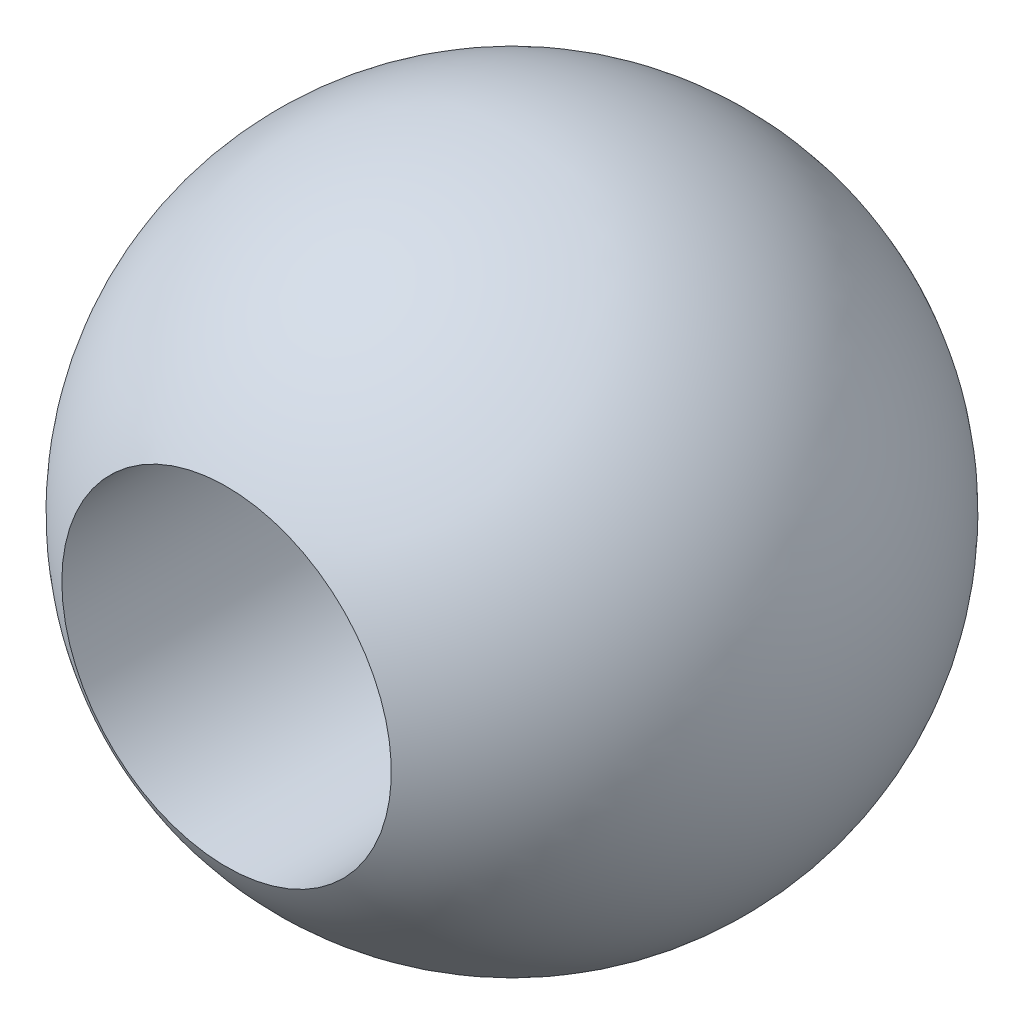
ISO-10303-21;
HEADER;
FILE_DESCRIPTION(('STEP AP214'),'2;1');
FILE_NAME('part.step','',(''),(''),'','','');
FILE_SCHEMA(('AUTOMOTIVE_DESIGN { 1 0 10303 214 1 1 1 1 }'));
ENDSEC;
DATA;
#1=APPLICATION_CONTEXT('core data for automotive mechanical design processes');
#2=APPLICATION_PROTOCOL_DEFINITION('international standard','automotive_design',2000,#1);
#3=PRODUCT_CONTEXT('',#1,'mechanical');
#4=PRODUCT('Part','Part','',(#3));
#5=PRODUCT_RELATED_PRODUCT_CATEGORY('part','',(#4));
#6=PRODUCT_DEFINITION_FORMATION('','',#4);
#7=PRODUCT_DEFINITION_CONTEXT('part definition',#1,'design');
#8=PRODUCT_DEFINITION('design','',#6,#7);
#9=PRODUCT_DEFINITION_SHAPE('','',#8);
#10=(LENGTH_UNIT() NAMED_UNIT(*) SI_UNIT(.MILLI.,.METRE.));
#11=(NAMED_UNIT(*) PLANE_ANGLE_UNIT() SI_UNIT($,.RADIAN.));
#12=(NAMED_UNIT(*) SI_UNIT($,.STERADIAN.) SOLID_ANGLE_UNIT());
#13=UNCERTAINTY_MEASURE_WITH_UNIT(LENGTH_MEASURE(1.E-05),#10,'distance_accuracy_value','');
#14=(GEOMETRIC_REPRESENTATION_CONTEXT(3) GLOBAL_UNCERTAINTY_ASSIGNED_CONTEXT((#13)) GLOBAL_UNIT_ASSIGNED_CONTEXT((#10,
#11,#12)) REPRESENTATION_CONTEXT('',''));
#15=CARTESIAN_POINT('',(0.,0.,0.));
#16=DIRECTION('',(0.,0.,1.));
#17=DIRECTION('',(1.,0.,0.));
#18=AXIS2_PLACEMENT_3D('',#15,#16,#17);
#19=CARTESIAN_POINT('',(0.,0.,0.));
#20=DIRECTION('',(0.,1.,0.));
#21=DIRECTION('',(1.,0.,0.));
#22=AXIS2_PLACEMENT_3D('',#19,#20,#21);
#23=SPHERICAL_SURFACE('',#22,4.);
#24=CARTESIAN_POINT('',(0.,0.,0.));
#25=DIRECTION('',(0.,0.,-1.));
#26=DIRECTION('',(-1.,0.,0.));
#27=AXIS2_PLACEMENT_3D('',#24,#25,#26);
#28=SPHERICAL_SURFACE('',#27,4.);
#29=CARTESIAN_POINT('',(0.,0.,3.46410161513775));
#30=DIRECTION('',(0.,0.,-1.));
#31=DIRECTION('',(-1.,0.,0.));
#32=AXIS2_PLACEMENT_3D('',#29,#30,#31);
#33=CIRCLE('',#32,2.);
#34=CARTESIAN_POINT('',(-2.,0.,3.46410161513775));
#35=VERTEX_POINT('',#34);
#36=EDGE_CURVE('E10',#35,#35,#33,.T.);
#37=ORIENTED_EDGE('',*,*,#36,.T.);
#38=EDGE_LOOP('',(#37));
#39=FACE_BOUND('',#38,.T.);
#40=CARTESIAN_POINT('',(0.,0.,-3.46410161513775));
#41=DIRECTION('',(0.,0.,1.));
#42=DIRECTION('',(1.,0.,0.));
#43=AXIS2_PLACEMENT_3D('',#40,#41,#42);
#44=CIRCLE('',#43,2.);
#45=CARTESIAN_POINT('',(2.,0.,-3.46410161513775));
#46=VERTEX_POINT('',#45);
#47=EDGE_CURVE('E44',#46,#46,#44,.T.);
#48=ORIENTED_EDGE('',*,*,#47,.T.);
#49=EDGE_LOOP('',(#48));
#50=FACE_BOUND('',#49,.T.);
#51=ADVANCED_FACE('F38',(#39,#50),#28,.T.);
#52=CARTESIAN_POINT('',(0.,0.,-4.));
#53=DIRECTION('',(0.,0.,1.));
#54=DIRECTION('',(1.,0.,0.));
#55=AXIS2_PLACEMENT_3D('',#52,#53,#54);
#56=CYLINDRICAL_SURFACE('',#55,2.);
#57=ORIENTED_EDGE('',*,*,#47,.F.);
#58=EDGE_LOOP('',(#57));
#59=FACE_BOUND('',#58,.T.);
#60=ORIENTED_EDGE('',*,*,#36,.F.);
#61=EDGE_LOOP('',(#60));
#62=FACE_BOUND('',#61,.T.);
#63=ADVANCED_FACE('F51',(#59,#62),#56,.F.);
#64=CLOSED_SHELL('',(#51,#63));
#65=MANIFOLD_SOLID_BREP('B2',#64);
#66=ADVANCED_BREP_SHAPE_REPRESENTATION('',(#18,#65),#14);
#67=SHAPE_DEFINITION_REPRESENTATION(#9,#66);
ENDSEC;
END-ISO-10303-21;
